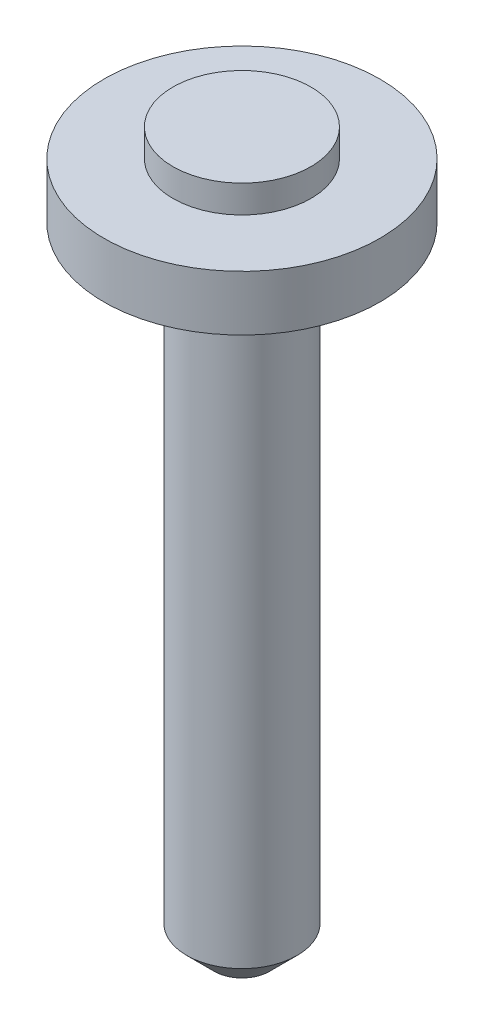
ISO-10303-21;
HEADER;
FILE_DESCRIPTION(('STEP AP214'),'2;1');
FILE_NAME('part.step','',(''),(''),'','','');
FILE_SCHEMA(('AUTOMOTIVE_DESIGN { 1 0 10303 214 1 1 1 1 }'));
ENDSEC;
DATA;
#1=APPLICATION_CONTEXT('core data for automotive mechanical design processes');
#2=APPLICATION_PROTOCOL_DEFINITION('international standard','automotive_design',2000,#1);
#3=PRODUCT_CONTEXT('',#1,'mechanical');
#4=PRODUCT('Part','Part','',(#3));
#5=PRODUCT_RELATED_PRODUCT_CATEGORY('part','',(#4));
#6=PRODUCT_DEFINITION_FORMATION('','',#4);
#7=PRODUCT_DEFINITION_CONTEXT('part definition',#1,'design');
#8=PRODUCT_DEFINITION('design','',#6,#7);
#9=PRODUCT_DEFINITION_SHAPE('','',#8);
#10=(LENGTH_UNIT() NAMED_UNIT(*) SI_UNIT(.MILLI.,.METRE.));
#11=(NAMED_UNIT(*) PLANE_ANGLE_UNIT() SI_UNIT($,.RADIAN.));
#12=(NAMED_UNIT(*) SI_UNIT($,.STERADIAN.) SOLID_ANGLE_UNIT());
#13=UNCERTAINTY_MEASURE_WITH_UNIT(LENGTH_MEASURE(1.E-05),#10,'distance_accuracy_value','');
#14=(GEOMETRIC_REPRESENTATION_CONTEXT(3) GLOBAL_UNCERTAINTY_ASSIGNED_CONTEXT((#13)) GLOBAL_UNIT_ASSIGNED_CONTEXT((#10,
#11,#12)) REPRESENTATION_CONTEXT('',''));
#15=CARTESIAN_POINT('',(0.,0.,0.));
#16=DIRECTION('',(0.,0.,1.));
#17=DIRECTION('',(1.,0.,0.));
#18=AXIS2_PLACEMENT_3D('',#15,#16,#17);
#19=CARTESIAN_POINT('',(0.,25.,0.));
#20=DIRECTION('',(0.,-1.,0.));
#21=DIRECTION('',(0.,0.,-1.));
#22=AXIS2_PLACEMENT_3D('',#19,#20,#21);
#23=PLANE('',#22);
#24=CARTESIAN_POINT('',(0.,25.,0.));
#25=DIRECTION('',(0.,1.,0.));
#26=DIRECTION('',(0.,0.,1.));
#27=AXIS2_PLACEMENT_3D('',#24,#25,#26);
#28=CIRCLE('',#27,2.5);
#29=CARTESIAN_POINT('',(0.,25.,2.5));
#30=VERTEX_POINT('',#29);
#31=EDGE_CURVE('E10',#30,#30,#28,.T.);
#32=ORIENTED_EDGE('',*,*,#31,.F.);
#33=EDGE_LOOP('',(#32));
#34=FACE_BOUND('',#33,.T.);
#35=CARTESIAN_POINT('',(0.,25.,0.));
#36=DIRECTION('',(0.,-1.,0.));
#37=DIRECTION('',(0.,0.,-1.));
#38=AXIS2_PLACEMENT_3D('',#35,#36,#37);
#39=CIRCLE('',#38,5.);
#40=CARTESIAN_POINT('',(0.,25.,-5.));
#41=VERTEX_POINT('',#40);
#42=EDGE_CURVE('E71',#41,#41,#39,.T.);
#43=ORIENTED_EDGE('',*,*,#42,.F.);
#44=EDGE_LOOP('',(#43));
#45=FACE_BOUND('',#44,.T.);
#46=ADVANCED_FACE('F36',(#34,#45),#23,.F.);
#47=CARTESIAN_POINT('',(0.,0.,0.));
#48=DIRECTION('',(0.,-1.,0.));
#49=DIRECTION('',(0.,0.,-1.));
#50=AXIS2_PLACEMENT_3D('',#47,#48,#49);
#51=CYLINDRICAL_SURFACE('',#50,5.);
#52=CARTESIAN_POINT('',(0.,23.,0.));
#53=DIRECTION('',(0.,-1.,0.));
#54=DIRECTION('',(0.,0.,-1.));
#55=AXIS2_PLACEMENT_3D('',#52,#53,#54);
#56=CIRCLE('',#55,5.);
#57=CARTESIAN_POINT('',(0.,23.,-5.));
#58=VERTEX_POINT('',#57);
#59=EDGE_CURVE('E68',#58,#58,#56,.T.);
#60=ORIENTED_EDGE('',*,*,#59,.F.);
#61=EDGE_LOOP('',(#60));
#62=FACE_BOUND('',#61,.T.);
#63=ORIENTED_EDGE('',*,*,#42,.T.);
#64=EDGE_LOOP('',(#63));
#65=FACE_BOUND('',#64,.T.);
#66=ADVANCED_FACE('F95',(#62,#65),#51,.T.);
#67=CARTESIAN_POINT('',(-5.,23.,0.));
#68=DIRECTION('',(0.,1.,0.));
#69=DIRECTION('',(0.,0.,1.));
#70=AXIS2_PLACEMENT_3D('',#67,#68,#69);
#71=PLANE('',#70);
#72=CARTESIAN_POINT('',(0.,23.,0.));
#73=DIRECTION('',(0.,-1.,0.));
#74=DIRECTION('',(0.,0.,-1.));
#75=AXIS2_PLACEMENT_3D('',#72,#73,#74);
#76=CIRCLE('',#75,2.5);
#77=CARTESIAN_POINT('',(0.,23.,-2.5));
#78=VERTEX_POINT('',#77);
#79=EDGE_CURVE('E65',#78,#78,#76,.T.);
#80=ORIENTED_EDGE('',*,*,#79,.F.);
#81=EDGE_LOOP('',(#80));
#82=FACE_BOUND('',#81,.T.);
#83=ORIENTED_EDGE('',*,*,#59,.T.);
#84=EDGE_LOOP('',(#83));
#85=FACE_BOUND('',#84,.T.);
#86=ADVANCED_FACE('F100',(#82,#85),#71,.F.);
#87=CARTESIAN_POINT('',(0.,0.,0.));
#88=DIRECTION('',(0.,-1.,0.));
#89=DIRECTION('',(0.,0.,-1.));
#90=AXIS2_PLACEMENT_3D('',#87,#88,#89);
#91=CYLINDRICAL_SURFACE('',#90,2.5);
#92=CARTESIAN_POINT('',(0.,22.,0.));
#93=DIRECTION('',(0.,-1.,0.));
#94=DIRECTION('',(0.,0.,-1.));
#95=AXIS2_PLACEMENT_3D('',#92,#93,#94);
#96=CIRCLE('',#95,2.5);
#97=CARTESIAN_POINT('',(0.,22.,-2.5));
#98=VERTEX_POINT('',#97);
#99=EDGE_CURVE('E62',#98,#98,#96,.T.);
#100=ORIENTED_EDGE('',*,*,#99,.F.);
#101=EDGE_LOOP('',(#100));
#102=FACE_BOUND('',#101,.T.);
#103=ORIENTED_EDGE('',*,*,#79,.T.);
#104=EDGE_LOOP('',(#103));
#105=FACE_BOUND('',#104,.T.);
#106=ADVANCED_FACE('F107',(#102,#105),#91,.T.);
#107=CARTESIAN_POINT('',(-2.5,22.,0.));
#108=DIRECTION('',(0.,1.,0.));
#109=DIRECTION('',(0.,0.,1.));
#110=AXIS2_PLACEMENT_3D('',#107,#108,#109);
#111=PLANE('',#110);
#112=CARTESIAN_POINT('',(0.,22.,0.));
#113=DIRECTION('',(0.,-1.,0.));
#114=DIRECTION('',(0.,0.,-1.));
#115=AXIS2_PLACEMENT_3D('',#112,#113,#114);
#116=CIRCLE('',#115,2.);
#117=CARTESIAN_POINT('',(0.,22.,-2.));
#118=VERTEX_POINT('',#117);
#119=EDGE_CURVE('E59',#118,#118,#116,.T.);
#120=ORIENTED_EDGE('',*,*,#119,.F.);
#121=EDGE_LOOP('',(#120));
#122=FACE_BOUND('',#121,.T.);
#123=ORIENTED_EDGE('',*,*,#99,.T.);
#124=EDGE_LOOP('',(#123));
#125=FACE_BOUND('',#124,.T.);
#126=ADVANCED_FACE('F111',(#122,#125),#111,.F.);
#127=CARTESIAN_POINT('',(0.,0.,0.));
#128=DIRECTION('',(0.,-1.,0.));
#129=DIRECTION('',(0.,0.,-1.));
#130=AXIS2_PLACEMENT_3D('',#127,#128,#129);
#131=CYLINDRICAL_SURFACE('',#130,2.);
#132=CARTESIAN_POINT('',(0.,1.00000000000001,0.));
#133=DIRECTION('',(0.,1.,0.));
#134=DIRECTION('',(0.,0.,1.));
#135=AXIS2_PLACEMENT_3D('',#132,#133,#134);
#136=CIRCLE('',#135,2.);
#137=CARTESIAN_POINT('',(0.,1.00000000000001,2.));
#138=VERTEX_POINT('',#137);
#139=EDGE_CURVE('E41',#138,#138,#136,.T.);
#140=ORIENTED_EDGE('',*,*,#139,.T.);
#141=EDGE_LOOP('',(#140));
#142=FACE_BOUND('',#141,.T.);
#143=ORIENTED_EDGE('',*,*,#119,.T.);
#144=EDGE_LOOP('',(#143));
#145=FACE_BOUND('',#144,.T.);
#146=ADVANCED_FACE('F115',(#142,#145),#131,.T.);
#147=CARTESIAN_POINT('',(-2.,0.,0.));
#148=DIRECTION('',(0.,1.,0.));
#149=DIRECTION('',(0.,0.,1.));
#150=AXIS2_PLACEMENT_3D('',#147,#148,#149);
#151=PLANE('',#150);
#152=CARTESIAN_POINT('',(0.,0.,0.));
#153=DIRECTION('',(0.,1.,0.));
#154=DIRECTION('',(0.,0.,1.));
#155=AXIS2_PLACEMENT_3D('',#152,#153,#154);
#156=CIRCLE('',#155,0.99999999999999);
#157=CARTESIAN_POINT('',(0.,0.,0.99999999999999));
#158=VERTEX_POINT('',#157);
#159=EDGE_CURVE('E49',#158,#158,#156,.F.);
#160=ORIENTED_EDGE('',*,*,#159,.T.);
#161=EDGE_LOOP('',(#160));
#162=FACE_BOUND('',#161,.T.);
#163=CARTESIAN_POINT('',(0.,0.,0.));
#164=DIRECTION('',(0.,-1.,0.));
#165=DIRECTION('',(0.,0.,-1.));
#166=AXIS2_PLACEMENT_3D('',#163,#164,#165);
#167=CIRCLE('',#166,0.45);
#168=CARTESIAN_POINT('',(0.,0.,-0.45));
#169=VERTEX_POINT('',#168);
#170=EDGE_CURVE('E56',#169,#169,#167,.T.);
#171=ORIENTED_EDGE('',*,*,#170,.F.);
#172=EDGE_LOOP('',(#171));
#173=FACE_BOUND('',#172,.T.);
#174=ADVANCED_FACE('F76',(#162,#173),#151,.F.);
#175=CARTESIAN_POINT('',(0.,0.,0.));
#176=DIRECTION('',(0.,-1.,0.));
#177=DIRECTION('',(0.,0.,-1.));
#178=AXIS2_PLACEMENT_3D('',#175,#176,#177);
#179=CYLINDRICAL_SURFACE('',#178,0.45);
#180=CARTESIAN_POINT('',(0.,19.,0.));
#181=DIRECTION('',(0.,-1.,0.));
#182=DIRECTION('',(0.,0.,-1.));
#183=AXIS2_PLACEMENT_3D('',#180,#181,#182);
#184=CIRCLE('',#183,0.45);
#185=CARTESIAN_POINT('',(0.,19.,-0.45));
#186=VERTEX_POINT('',#185);
#187=EDGE_CURVE('E53',#186,#186,#184,.T.);
#188=ORIENTED_EDGE('',*,*,#187,.F.);
#189=EDGE_LOOP('',(#188));
#190=FACE_BOUND('',#189,.T.);
#191=ORIENTED_EDGE('',*,*,#170,.T.);
#192=EDGE_LOOP('',(#191));
#193=FACE_BOUND('',#192,.T.);
#194=ADVANCED_FACE('F90',(#190,#193),#179,.F.);
#195=CARTESIAN_POINT('',(-0.45,19.,0.));
#196=DIRECTION('',(0.,1.,0.));
#197=DIRECTION('',(0.,0.,1.));
#198=AXIS2_PLACEMENT_3D('',#195,#196,#197);
#199=PLANE('',#198);
#200=ORIENTED_EDGE('',*,*,#187,.T.);
#201=EDGE_LOOP('',(#200));
#202=FACE_BOUND('',#201,.T.);
#203=ADVANCED_FACE('F81',(#202),#199,.F.);
#204=CARTESIAN_POINT('',(0.,0.,0.));
#205=DIRECTION('',(0.,1.,0.));
#206=DIRECTION('',(0.,0.,1.));
#207=AXIS2_PLACEMENT_3D('',#204,#205,#206);
#208=CONICAL_SURFACE('',#207,0.99999999999999,0.785398163397447);
#209=ORIENTED_EDGE('',*,*,#139,.F.);
#210=EDGE_LOOP('',(#209));
#211=FACE_BOUND('',#210,.T.);
#212=ORIENTED_EDGE('',*,*,#159,.F.);
#213=EDGE_LOOP('',(#212));
#214=FACE_BOUND('',#213,.T.);
#215=ADVANCED_FACE('F39',(#211,#214),#208,.T.);
#216=CARTESIAN_POINT('',(0.,26.,0.));
#217=DIRECTION('',(0.,-1.,0.));
#218=DIRECTION('',(0.,0.,-1.));
#219=AXIS2_PLACEMENT_3D('',#216,#217,#218);
#220=CYLINDRICAL_SURFACE('',#219,2.5);
#221=CARTESIAN_POINT('',(0.,26.,0.));
#222=DIRECTION('',(0.,1.,0.));
#223=DIRECTION('',(0.,0.,1.));
#224=AXIS2_PLACEMENT_3D('',#221,#222,#223);
#225=CIRCLE('',#224,2.5);
#226=CARTESIAN_POINT('',(0.,26.,2.5));
#227=VERTEX_POINT('',#226);
#228=EDGE_CURVE('E52',#227,#227,#225,.T.);
#229=ORIENTED_EDGE('',*,*,#228,.F.);
#230=EDGE_LOOP('',(#229));
#231=FACE_BOUND('',#230,.T.);
#232=ORIENTED_EDGE('',*,*,#31,.T.);
#233=EDGE_LOOP('',(#232));
#234=FACE_BOUND('',#233,.T.);
#235=ADVANCED_FACE('F80',(#231,#234),#220,.T.);
#236=CARTESIAN_POINT('',(0.,26.,0.));
#237=DIRECTION('',(0.,1.,0.));
#238=DIRECTION('',(0.,0.,1.));
#239=AXIS2_PLACEMENT_3D('',#236,#237,#238);
#240=PLANE('',#239);
#241=ORIENTED_EDGE('',*,*,#228,.T.);
#242=EDGE_LOOP('',(#241));
#243=FACE_BOUND('',#242,.T.);
#244=ADVANCED_FACE('F87',(#243),#240,.T.);
#245=CLOSED_SHELL('',(#46,#66,#86,#106,#126,#146,#174,#194,#203,#215,#235,#244));
#246=MANIFOLD_SOLID_BREP('B2',#245);
#247=ADVANCED_BREP_SHAPE_REPRESENTATION('',(#18,#246),#14);
#248=SHAPE_DEFINITION_REPRESENTATION(#9,#247);
ENDSEC;
END-ISO-10303-21;
